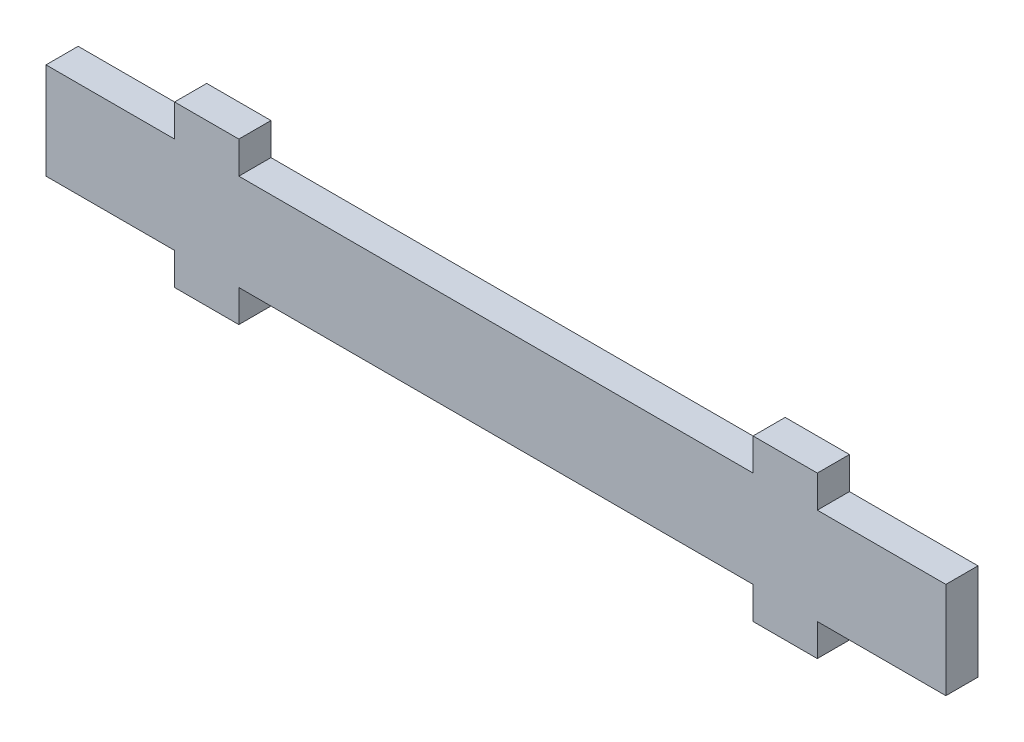
ISO-10303-21;
HEADER;
FILE_DESCRIPTION(('STEP AP214'),'2;1');
FILE_NAME('part.step','',(''),(''),'','','');
FILE_SCHEMA(('AUTOMOTIVE_DESIGN { 1 0 10303 214 1 1 1 1 }'));
ENDSEC;
DATA;
#1=APPLICATION_CONTEXT('core data for automotive mechanical design processes');
#2=APPLICATION_PROTOCOL_DEFINITION('international standard','automotive_design',2000,#1);
#3=PRODUCT_CONTEXT('',#1,'mechanical');
#4=PRODUCT('Part','Part','',(#3));
#5=PRODUCT_RELATED_PRODUCT_CATEGORY('part','',(#4));
#6=PRODUCT_DEFINITION_FORMATION('','',#4);
#7=PRODUCT_DEFINITION_CONTEXT('part definition',#1,'design');
#8=PRODUCT_DEFINITION('design','',#6,#7);
#9=PRODUCT_DEFINITION_SHAPE('','',#8);
#10=(LENGTH_UNIT() NAMED_UNIT(*) SI_UNIT(.MILLI.,.METRE.));
#11=(NAMED_UNIT(*) PLANE_ANGLE_UNIT() SI_UNIT($,.RADIAN.));
#12=(NAMED_UNIT(*) SI_UNIT($,.STERADIAN.) SOLID_ANGLE_UNIT());
#13=UNCERTAINTY_MEASURE_WITH_UNIT(LENGTH_MEASURE(1.E-05),#10,'distance_accuracy_value','');
#14=(GEOMETRIC_REPRESENTATION_CONTEXT(3) GLOBAL_UNCERTAINTY_ASSIGNED_CONTEXT((#13)) GLOBAL_UNIT_ASSIGNED_CONTEXT((#10,
#11,#12)) REPRESENTATION_CONTEXT('',''));
#15=CARTESIAN_POINT('',(0.,0.,0.));
#16=DIRECTION('',(0.,0.,1.));
#17=DIRECTION('',(1.,0.,0.));
#18=AXIS2_PLACEMENT_3D('',#15,#16,#17);
#19=CARTESIAN_POINT('',(0.,0.,6.35));
#20=DIRECTION('',(0.,1.,0.));
#21=DIRECTION('',(0.,0.,1.));
#22=AXIS2_PLACEMENT_3D('',#19,#20,#21);
#23=PLANE('',#22);
#24=DIRECTION('',(0.,0.,-1.));
#25=VECTOR('',#24,1.);
#26=CARTESIAN_POINT('',(139.7,0.,6.35));
#27=LINE('',#26,#25);
#28=CARTESIAN_POINT('',(139.7,0.,6.35));
#29=VERTEX_POINT('',#28);
#30=CARTESIAN_POINT('',(139.7,0.,0.));
#31=VERTEX_POINT('',#30);
#32=EDGE_CURVE('E57',#29,#31,#27,.T.);
#33=ORIENTED_EDGE('',*,*,#32,.F.);
#34=DIRECTION('',(1.,0.,0.));
#35=VECTOR('',#34,1.);
#36=CARTESIAN_POINT('',(0.,0.,6.35));
#37=LINE('',#36,#35);
#38=CARTESIAN_POINT('',(38.1,0.,6.35));
#39=VERTEX_POINT('',#38);
#40=EDGE_CURVE('E340',#39,#29,#37,.T.);
#41=ORIENTED_EDGE('',*,*,#40,.F.);
#42=DIRECTION('',(0.,0.,1.));
#43=VECTOR('',#42,1.);
#44=CARTESIAN_POINT('',(38.1,0.,6.35));
#45=LINE('',#44,#43);
#46=CARTESIAN_POINT('',(38.1,0.,0.));
#47=VERTEX_POINT('',#46);
#48=EDGE_CURVE('E199',#47,#39,#45,.T.);
#49=ORIENTED_EDGE('',*,*,#48,.F.);
#50=DIRECTION('',(1.,0.,0.));
#51=VECTOR('',#50,1.);
#52=CARTESIAN_POINT('',(0.,0.,0.));
#53=LINE('',#52,#51);
#54=EDGE_CURVE('E229',#47,#31,#53,.T.);
#55=ORIENTED_EDGE('',*,*,#54,.T.);
#56=EDGE_LOOP('',(#33,#41,#49,#55));
#57=FACE_BOUND('',#56,.T.);
#58=ADVANCED_FACE('F32',(#57),#23,.F.);
#59=DIRECTION('',(0.,0.,1.));
#60=VECTOR('',#59,1.);
#61=CARTESIAN_POINT('',(152.4,0.,6.35));
#62=LINE('',#61,#60);
#63=CARTESIAN_POINT('',(152.4,0.,0.));
#64=VERTEX_POINT('',#63);
#65=CARTESIAN_POINT('',(152.4,0.,6.35));
#66=VERTEX_POINT('',#65);
#67=EDGE_CURVE('E193',#64,#66,#62,.T.);
#68=ORIENTED_EDGE('',*,*,#67,.F.);
#69=CARTESIAN_POINT('',(177.8,0.,0.));
#70=VERTEX_POINT('',#69);
#71=EDGE_CURVE('E227',#64,#70,#53,.T.);
#72=ORIENTED_EDGE('',*,*,#71,.T.);
#73=DIRECTION('',(0.,0.,-1.));
#74=VECTOR('',#73,1.);
#75=CARTESIAN_POINT('',(177.8,0.,6.35));
#76=LINE('',#75,#74);
#77=CARTESIAN_POINT('',(177.8,0.,6.35));
#78=VERTEX_POINT('',#77);
#79=EDGE_CURVE('E42',#78,#70,#76,.T.);
#80=ORIENTED_EDGE('',*,*,#79,.F.);
#81=EDGE_CURVE('E36',#66,#78,#37,.T.);
#82=ORIENTED_EDGE('',*,*,#81,.F.);
#83=EDGE_LOOP('',(#68,#72,#80,#82));
#84=FACE_BOUND('',#83,.T.);
#85=ADVANCED_FACE('F358',(#84),#23,.F.);
#86=DIRECTION('',(0.,0.,-1.));
#87=VECTOR('',#86,1.);
#88=CARTESIAN_POINT('',(25.4,0.,6.35));
#89=LINE('',#88,#87);
#90=CARTESIAN_POINT('',(25.4,0.,6.35));
#91=VERTEX_POINT('',#90);
#92=CARTESIAN_POINT('',(25.4,0.,0.));
#93=VERTEX_POINT('',#92);
#94=EDGE_CURVE('E196',#91,#93,#89,.T.);
#95=ORIENTED_EDGE('',*,*,#94,.F.);
#96=CARTESIAN_POINT('',(0.,0.,6.35));
#97=VERTEX_POINT('',#96);
#98=EDGE_CURVE('E342',#97,#91,#37,.T.);
#99=ORIENTED_EDGE('',*,*,#98,.F.);
#100=DIRECTION('',(0.,0.,-1.));
#101=VECTOR('',#100,1.);
#102=CARTESIAN_POINT('',(0.,0.,6.35));
#103=LINE('',#102,#101);
#104=CARTESIAN_POINT('',(0.,0.,0.));
#105=VERTEX_POINT('',#104);
#106=EDGE_CURVE('E11',#97,#105,#103,.T.);
#107=ORIENTED_EDGE('',*,*,#106,.T.);
#108=EDGE_CURVE('E242',#105,#93,#53,.T.);
#109=ORIENTED_EDGE('',*,*,#108,.T.);
#110=EDGE_LOOP('',(#95,#99,#107,#109));
#111=FACE_BOUND('',#110,.T.);
#112=ADVANCED_FACE('F360',(#111),#23,.F.);
#113=CARTESIAN_POINT('',(0.,19.05,6.35));
#114=DIRECTION('',(0.,-1.,0.));
#115=DIRECTION('',(0.,0.,-1.));
#116=AXIS2_PLACEMENT_3D('',#113,#114,#115);
#117=PLANE('',#116);
#118=DIRECTION('',(0.,0.,1.));
#119=VECTOR('',#118,1.);
#120=CARTESIAN_POINT('',(139.7,19.05,0.));
#121=LINE('',#120,#119);
#122=CARTESIAN_POINT('',(139.7,19.05,0.));
#123=VERTEX_POINT('',#122);
#124=CARTESIAN_POINT('',(139.7,19.05,6.35));
#125=VERTEX_POINT('',#124);
#126=EDGE_CURVE('E297',#123,#125,#121,.T.);
#127=ORIENTED_EDGE('',*,*,#126,.F.);
#128=DIRECTION('',(-1.,0.,0.));
#129=VECTOR('',#128,1.);
#130=CARTESIAN_POINT('',(0.,19.05,0.));
#131=LINE('',#130,#129);
#132=CARTESIAN_POINT('',(38.1,19.05,0.));
#133=VERTEX_POINT('',#132);
#134=EDGE_CURVE('E248',#123,#133,#131,.T.);
#135=ORIENTED_EDGE('',*,*,#134,.T.);
#136=DIRECTION('',(0.,0.,-1.));
#137=VECTOR('',#136,1.);
#138=CARTESIAN_POINT('',(38.1,19.05,0.));
#139=LINE('',#138,#137);
#140=CARTESIAN_POINT('',(38.1,19.05,6.35));
#141=VERTEX_POINT('',#140);
#142=EDGE_CURVE('E294',#141,#133,#139,.T.);
#143=ORIENTED_EDGE('',*,*,#142,.F.);
#144=DIRECTION('',(-1.,0.,0.));
#145=VECTOR('',#144,1.);
#146=CARTESIAN_POINT('',(0.,19.05,6.35));
#147=LINE('',#146,#145);
#148=EDGE_CURVE('E244',#125,#141,#147,.T.);
#149=ORIENTED_EDGE('',*,*,#148,.F.);
#150=EDGE_LOOP('',(#127,#135,#143,#149));
#151=FACE_BOUND('',#150,.T.);
#152=ADVANCED_FACE('F293',(#151),#117,.F.);
#153=DIRECTION('',(0.,0.,-1.));
#154=VECTOR('',#153,1.);
#155=CARTESIAN_POINT('',(152.4,19.05,0.));
#156=LINE('',#155,#154);
#157=CARTESIAN_POINT('',(152.4,19.05,6.35));
#158=VERTEX_POINT('',#157);
#159=CARTESIAN_POINT('',(152.4,19.05,0.));
#160=VERTEX_POINT('',#159);
#161=EDGE_CURVE('E576',#158,#160,#156,.T.);
#162=ORIENTED_EDGE('',*,*,#161,.F.);
#163=CARTESIAN_POINT('',(177.8,19.05,6.35));
#164=VERTEX_POINT('',#163);
#165=EDGE_CURVE('E246',#164,#158,#147,.T.);
#166=ORIENTED_EDGE('',*,*,#165,.F.);
#167=DIRECTION('',(0.,0.,-1.));
#168=VECTOR('',#167,1.);
#169=CARTESIAN_POINT('',(177.8,19.05,6.35));
#170=LINE('',#169,#168);
#171=CARTESIAN_POINT('',(177.8,19.05,0.));
#172=VERTEX_POINT('',#171);
#173=EDGE_CURVE('E270',#164,#172,#170,.T.);
#174=ORIENTED_EDGE('',*,*,#173,.T.);
#175=EDGE_CURVE('E263',#172,#160,#131,.T.);
#176=ORIENTED_EDGE('',*,*,#175,.T.);
#177=EDGE_LOOP('',(#162,#166,#174,#176));
#178=FACE_BOUND('',#177,.T.);
#179=ADVANCED_FACE('F372',(#178),#117,.F.);
#180=DIRECTION('',(0.,0.,1.));
#181=VECTOR('',#180,1.);
#182=CARTESIAN_POINT('',(25.4,19.05,0.));
#183=LINE('',#182,#181);
#184=CARTESIAN_POINT('',(25.4,19.05,0.));
#185=VERTEX_POINT('',#184);
#186=CARTESIAN_POINT('',(25.4,19.05,6.35));
#187=VERTEX_POINT('',#186);
#188=EDGE_CURVE('E310',#185,#187,#183,.T.);
#189=ORIENTED_EDGE('',*,*,#188,.F.);
#190=CARTESIAN_POINT('',(0.,19.05,0.));
#191=VERTEX_POINT('',#190);
#192=EDGE_CURVE('E261',#185,#191,#131,.T.);
#193=ORIENTED_EDGE('',*,*,#192,.T.);
#194=DIRECTION('',(0.,0.,-1.));
#195=VECTOR('',#194,1.);
#196=CARTESIAN_POINT('',(0.,19.05,6.35));
#197=LINE('',#196,#195);
#198=CARTESIAN_POINT('',(0.,19.05,6.35));
#199=VERTEX_POINT('',#198);
#200=EDGE_CURVE('E260',#199,#191,#197,.T.);
#201=ORIENTED_EDGE('',*,*,#200,.F.);
#202=EDGE_CURVE('E247',#187,#199,#147,.T.);
#203=ORIENTED_EDGE('',*,*,#202,.F.);
#204=EDGE_LOOP('',(#189,#193,#201,#203));
#205=FACE_BOUND('',#204,.T.);
#206=ADVANCED_FACE('F369',(#205),#117,.F.);
#207=CARTESIAN_POINT('',(0.,0.,6.35));
#208=DIRECTION('',(1.,0.,0.));
#209=DIRECTION('',(0.,0.,-1.));
#210=AXIS2_PLACEMENT_3D('',#207,#208,#209);
#211=PLANE('',#210);
#212=DIRECTION('',(0.,-1.,0.));
#213=VECTOR('',#212,1.);
#214=CARTESIAN_POINT('',(0.,0.,0.));
#215=LINE('',#214,#213);
#216=EDGE_CURVE('E230',#191,#105,#215,.T.);
#217=ORIENTED_EDGE('',*,*,#216,.T.);
#218=ORIENTED_EDGE('',*,*,#106,.F.);
#219=DIRECTION('',(0.,-1.,0.));
#220=VECTOR('',#219,1.);
#221=CARTESIAN_POINT('',(0.,0.,6.35));
#222=LINE('',#221,#220);
#223=EDGE_CURVE('E286',#199,#97,#222,.T.);
#224=ORIENTED_EDGE('',*,*,#223,.F.);
#225=ORIENTED_EDGE('',*,*,#200,.T.);
#226=EDGE_LOOP('',(#217,#218,#224,#225));
#227=FACE_BOUND('',#226,.T.);
#228=ADVANCED_FACE('F34',(#227),#211,.F.);
#229=CARTESIAN_POINT('',(177.8,0.,6.35));
#230=DIRECTION('',(-1.,0.,0.));
#231=DIRECTION('',(0.,0.,1.));
#232=AXIS2_PLACEMENT_3D('',#229,#230,#231);
#233=PLANE('',#232);
#234=DIRECTION('',(0.,1.,0.));
#235=VECTOR('',#234,1.);
#236=CARTESIAN_POINT('',(177.8,0.,0.));
#237=LINE('',#236,#235);
#238=EDGE_CURVE('E235',#70,#172,#237,.T.);
#239=ORIENTED_EDGE('',*,*,#238,.T.);
#240=ORIENTED_EDGE('',*,*,#173,.F.);
#241=DIRECTION('',(0.,1.,0.));
#242=VECTOR('',#241,1.);
#243=CARTESIAN_POINT('',(177.8,0.,6.35));
#244=LINE('',#243,#242);
#245=EDGE_CURVE('E252',#78,#164,#244,.T.);
#246=ORIENTED_EDGE('',*,*,#245,.F.);
#247=ORIENTED_EDGE('',*,*,#79,.T.);
#248=EDGE_LOOP('',(#239,#240,#246,#247));
#249=FACE_BOUND('',#248,.T.);
#250=ADVANCED_FACE('F277',(#249),#233,.F.);
#251=CARTESIAN_POINT('',(0.,0.,6.35));
#252=DIRECTION('',(0.,0.,-1.));
#253=DIRECTION('',(-1.,0.,0.));
#254=AXIS2_PLACEMENT_3D('',#251,#252,#253);
#255=PLANE('',#254);
#256=ORIENTED_EDGE('',*,*,#223,.T.);
#257=ORIENTED_EDGE('',*,*,#98,.T.);
#258=DIRECTION('',(0.,1.,0.));
#259=VECTOR('',#258,1.);
#260=CARTESIAN_POINT('',(25.4,-6.35,6.35));
#261=LINE('',#260,#259);
#262=CARTESIAN_POINT('',(25.4,-6.35,6.35));
#263=VERTEX_POINT('',#262);
#264=EDGE_CURVE('E214',#263,#91,#261,.T.);
#265=ORIENTED_EDGE('',*,*,#264,.F.);
#266=DIRECTION('',(-1.,0.,0.));
#267=VECTOR('',#266,1.);
#268=CARTESIAN_POINT('',(25.4,-6.35,6.35));
#269=LINE('',#268,#267);
#270=CARTESIAN_POINT('',(38.1,-6.35,6.35));
#271=VERTEX_POINT('',#270);
#272=EDGE_CURVE('E212',#271,#263,#269,.T.);
#273=ORIENTED_EDGE('',*,*,#272,.F.);
#274=DIRECTION('',(0.,1.,0.));
#275=VECTOR('',#274,1.);
#276=CARTESIAN_POINT('',(38.1,-6.35,6.35));
#277=LINE('',#276,#275);
#278=EDGE_CURVE('E225',#271,#39,#277,.T.);
#279=ORIENTED_EDGE('',*,*,#278,.T.);
#280=ORIENTED_EDGE('',*,*,#40,.T.);
#281=DIRECTION('',(0.,1.,0.));
#282=VECTOR('',#281,1.);
#283=CARTESIAN_POINT('',(139.7,-6.35,6.35));
#284=LINE('',#283,#282);
#285=CARTESIAN_POINT('',(139.7,-6.35,6.35));
#286=VERTEX_POINT('',#285);
#287=EDGE_CURVE('E351',#286,#29,#284,.T.);
#288=ORIENTED_EDGE('',*,*,#287,.F.);
#289=DIRECTION('',(-1.,0.,0.));
#290=VECTOR('',#289,1.);
#291=CARTESIAN_POINT('',(139.7,-6.35,6.35));
#292=LINE('',#291,#290);
#293=CARTESIAN_POINT('',(152.4,-6.35,6.35));
#294=VERTEX_POINT('',#293);
#295=EDGE_CURVE('E189',#294,#286,#292,.T.);
#296=ORIENTED_EDGE('',*,*,#295,.F.);
#297=DIRECTION('',(0.,1.,0.));
#298=VECTOR('',#297,1.);
#299=CARTESIAN_POINT('',(152.4,-6.35,6.35));
#300=LINE('',#299,#298);
#301=EDGE_CURVE('E201',#294,#66,#300,.T.);
#302=ORIENTED_EDGE('',*,*,#301,.T.);
#303=ORIENTED_EDGE('',*,*,#81,.T.);
#304=ORIENTED_EDGE('',*,*,#245,.T.);
#305=ORIENTED_EDGE('',*,*,#165,.T.);
#306=DIRECTION('',(0.,-1.,0.));
#307=VECTOR('',#306,1.);
#308=CARTESIAN_POINT('',(152.4,25.4,6.35));
#309=LINE('',#308,#307);
#310=CARTESIAN_POINT('',(152.4,25.4,6.35));
#311=VERTEX_POINT('',#310);
#312=EDGE_CURVE('E581',#311,#158,#309,.T.);
#313=ORIENTED_EDGE('',*,*,#312,.F.);
#314=DIRECTION('',(1.,0.,0.));
#315=VECTOR('',#314,1.);
#316=CARTESIAN_POINT('',(139.7,25.4,6.35));
#317=LINE('',#316,#315);
#318=CARTESIAN_POINT('',(139.7,25.4,6.35));
#319=VERTEX_POINT('',#318);
#320=EDGE_CURVE('E600',#319,#311,#317,.T.);
#321=ORIENTED_EDGE('',*,*,#320,.F.);
#322=DIRECTION('',(0.,-1.,0.));
#323=VECTOR('',#322,1.);
#324=CARTESIAN_POINT('',(139.7,25.4,6.35));
#325=LINE('',#324,#323);
#326=EDGE_CURVE('E331',#319,#125,#325,.T.);
#327=ORIENTED_EDGE('',*,*,#326,.T.);
#328=ORIENTED_EDGE('',*,*,#148,.T.);
#329=DIRECTION('',(0.,-1.,0.));
#330=VECTOR('',#329,1.);
#331=CARTESIAN_POINT('',(38.1,25.4,6.35));
#332=LINE('',#331,#330);
#333=CARTESIAN_POINT('',(38.1,25.4,6.35));
#334=VERTEX_POINT('',#333);
#335=EDGE_CURVE('E308',#334,#141,#332,.T.);
#336=ORIENTED_EDGE('',*,*,#335,.F.);
#337=DIRECTION('',(1.,0.,0.));
#338=VECTOR('',#337,1.);
#339=CARTESIAN_POINT('',(25.4,25.4,6.35));
#340=LINE('',#339,#338);
#341=CARTESIAN_POINT('',(25.4,25.4,6.35));
#342=VERTEX_POINT('',#341);
#343=EDGE_CURVE('E593',#342,#334,#340,.T.);
#344=ORIENTED_EDGE('',*,*,#343,.F.);
#345=DIRECTION('',(0.,-1.,0.));
#346=VECTOR('',#345,1.);
#347=CARTESIAN_POINT('',(25.4,25.4,6.35));
#348=LINE('',#347,#346);
#349=EDGE_CURVE('E315',#342,#187,#348,.T.);
#350=ORIENTED_EDGE('',*,*,#349,.T.);
#351=ORIENTED_EDGE('',*,*,#202,.T.);
#352=EDGE_LOOP('',(#256,#257,#265,#273,#279,#280,#288,#296,#302,#303,#304,#305,#313,#321,#327,
#328,#336,#344,#350,#351));
#353=FACE_BOUND('',#352,.T.);
#354=ADVANCED_FACE('F348',(#353),#255,.F.);
#355=CARTESIAN_POINT('',(0.,0.,0.));
#356=DIRECTION('',(0.,0.,-1.));
#357=DIRECTION('',(-1.,0.,0.));
#358=AXIS2_PLACEMENT_3D('',#355,#356,#357);
#359=PLANE('',#358);
#360=ORIENTED_EDGE('',*,*,#216,.F.);
#361=ORIENTED_EDGE('',*,*,#192,.F.);
#362=DIRECTION('',(0.,-1.,0.));
#363=VECTOR('',#362,1.);
#364=CARTESIAN_POINT('',(25.4,25.4,0.));
#365=LINE('',#364,#363);
#366=CARTESIAN_POINT('',(25.4,25.4,0.));
#367=VERTEX_POINT('',#366);
#368=EDGE_CURVE('E313',#367,#185,#365,.T.);
#369=ORIENTED_EDGE('',*,*,#368,.F.);
#370=DIRECTION('',(-1.,0.,0.));
#371=VECTOR('',#370,1.);
#372=CARTESIAN_POINT('',(25.4,25.4,0.));
#373=LINE('',#372,#371);
#374=CARTESIAN_POINT('',(38.1,25.4,0.));
#375=VERTEX_POINT('',#374);
#376=EDGE_CURVE('E312',#375,#367,#373,.T.);
#377=ORIENTED_EDGE('',*,*,#376,.F.);
#378=DIRECTION('',(0.,-1.,0.));
#379=VECTOR('',#378,1.);
#380=CARTESIAN_POINT('',(38.1,25.4,0.));
#381=LINE('',#380,#379);
#382=EDGE_CURVE('E305',#375,#133,#381,.T.);
#383=ORIENTED_EDGE('',*,*,#382,.T.);
#384=ORIENTED_EDGE('',*,*,#134,.F.);
#385=DIRECTION('',(0.,-1.,0.));
#386=VECTOR('',#385,1.);
#387=CARTESIAN_POINT('',(139.7,25.4,0.));
#388=LINE('',#387,#386);
#389=CARTESIAN_POINT('',(139.7,25.4,0.));
#390=VERTEX_POINT('',#389);
#391=EDGE_CURVE('E587',#390,#123,#388,.T.);
#392=ORIENTED_EDGE('',*,*,#391,.F.);
#393=DIRECTION('',(-1.,0.,0.));
#394=VECTOR('',#393,1.);
#395=CARTESIAN_POINT('',(139.7,25.4,0.));
#396=LINE('',#395,#394);
#397=CARTESIAN_POINT('',(152.4,25.4,0.));
#398=VERTEX_POINT('',#397);
#399=EDGE_CURVE('E608',#398,#390,#396,.T.);
#400=ORIENTED_EDGE('',*,*,#399,.F.);
#401=DIRECTION('',(0.,-1.,0.));
#402=VECTOR('',#401,1.);
#403=CARTESIAN_POINT('',(152.4,25.4,0.));
#404=LINE('',#403,#402);
#405=EDGE_CURVE('E283',#398,#160,#404,.T.);
#406=ORIENTED_EDGE('',*,*,#405,.T.);
#407=ORIENTED_EDGE('',*,*,#175,.F.);
#408=ORIENTED_EDGE('',*,*,#238,.F.);
#409=ORIENTED_EDGE('',*,*,#71,.F.);
#410=DIRECTION('',(0.,1.,0.));
#411=VECTOR('',#410,1.);
#412=CARTESIAN_POINT('',(152.4,-6.35,0.));
#413=LINE('',#412,#411);
#414=CARTESIAN_POINT('',(152.4,-6.35,0.));
#415=VERTEX_POINT('',#414);
#416=EDGE_CURVE('E180',#415,#64,#413,.T.);
#417=ORIENTED_EDGE('',*,*,#416,.F.);
#418=DIRECTION('',(1.,0.,0.));
#419=VECTOR('',#418,1.);
#420=CARTESIAN_POINT('',(139.7,-6.35,0.));
#421=LINE('',#420,#419);
#422=CARTESIAN_POINT('',(139.7,-6.35,0.));
#423=VERTEX_POINT('',#422);
#424=EDGE_CURVE('E172',#423,#415,#421,.T.);
#425=ORIENTED_EDGE('',*,*,#424,.F.);
#426=DIRECTION('',(0.,1.,0.));
#427=VECTOR('',#426,1.);
#428=CARTESIAN_POINT('',(139.7,-6.35,0.));
#429=LINE('',#428,#427);
#430=EDGE_CURVE('E178',#423,#31,#429,.T.);
#431=ORIENTED_EDGE('',*,*,#430,.T.);
#432=ORIENTED_EDGE('',*,*,#54,.F.);
#433=DIRECTION('',(0.,1.,0.));
#434=VECTOR('',#433,1.);
#435=CARTESIAN_POINT('',(38.1,-6.35,0.));
#436=LINE('',#435,#434);
#437=CARTESIAN_POINT('',(38.1,-6.35,0.));
#438=VERTEX_POINT('',#437);
#439=EDGE_CURVE('E606',#438,#47,#436,.T.);
#440=ORIENTED_EDGE('',*,*,#439,.F.);
#441=DIRECTION('',(1.,0.,0.));
#442=VECTOR('',#441,1.);
#443=CARTESIAN_POINT('',(25.4,-6.35,0.));
#444=LINE('',#443,#442);
#445=CARTESIAN_POINT('',(25.4,-6.35,0.));
#446=VERTEX_POINT('',#445);
#447=EDGE_CURVE('E208',#446,#438,#444,.T.);
#448=ORIENTED_EDGE('',*,*,#447,.F.);
#449=DIRECTION('',(0.,1.,0.));
#450=VECTOR('',#449,1.);
#451=CARTESIAN_POINT('',(25.4,-6.35,0.));
#452=LINE('',#451,#450);
#453=EDGE_CURVE('E603',#446,#93,#452,.T.);
#454=ORIENTED_EDGE('',*,*,#453,.T.);
#455=ORIENTED_EDGE('',*,*,#108,.F.);
#456=EDGE_LOOP('',(#360,#361,#369,#377,#383,#384,#392,#400,#406,#407,#408,#409,#417,#425,#431,
#432,#440,#448,#454,#455));
#457=FACE_BOUND('',#456,.T.);
#458=ADVANCED_FACE('F175',(#457),#359,.T.);
#459=CARTESIAN_POINT('',(25.4,25.4,0.));
#460=DIRECTION('',(1.,0.,0.));
#461=DIRECTION('',(0.,0.,-1.));
#462=AXIS2_PLACEMENT_3D('',#459,#460,#461);
#463=PLANE('',#462);
#464=ORIENTED_EDGE('',*,*,#188,.T.);
#465=ORIENTED_EDGE('',*,*,#349,.F.);
#466=DIRECTION('',(0.,0.,1.));
#467=VECTOR('',#466,1.);
#468=CARTESIAN_POINT('',(25.4,25.4,0.));
#469=LINE('',#468,#467);
#470=EDGE_CURVE('E309',#367,#342,#469,.T.);
#471=ORIENTED_EDGE('',*,*,#470,.F.);
#472=ORIENTED_EDGE('',*,*,#368,.T.);
#473=EDGE_LOOP('',(#464,#465,#471,#472));
#474=FACE_BOUND('',#473,.T.);
#475=ADVANCED_FACE('F376',(#474),#463,.F.);
#476=CARTESIAN_POINT('',(38.1,25.4,0.));
#477=DIRECTION('',(-1.,0.,0.));
#478=DIRECTION('',(0.,0.,1.));
#479=AXIS2_PLACEMENT_3D('',#476,#477,#478);
#480=PLANE('',#479);
#481=ORIENTED_EDGE('',*,*,#142,.T.);
#482=ORIENTED_EDGE('',*,*,#382,.F.);
#483=DIRECTION('',(0.,0.,-1.));
#484=VECTOR('',#483,1.);
#485=CARTESIAN_POINT('',(38.1,25.4,0.));
#486=LINE('',#485,#484);
#487=EDGE_CURVE('E594',#334,#375,#486,.T.);
#488=ORIENTED_EDGE('',*,*,#487,.F.);
#489=ORIENTED_EDGE('',*,*,#335,.T.);
#490=EDGE_LOOP('',(#481,#482,#488,#489));
#491=FACE_BOUND('',#490,.T.);
#492=ADVANCED_FACE('F303',(#491),#480,.F.);
#493=CARTESIAN_POINT('',(0.,25.4,0.));
#494=DIRECTION('',(0.,1.,0.));
#495=DIRECTION('',(0.,0.,1.));
#496=AXIS2_PLACEMENT_3D('',#493,#494,#495);
#497=PLANE('',#496);
#498=ORIENTED_EDGE('',*,*,#470,.T.);
#499=ORIENTED_EDGE('',*,*,#343,.T.);
#500=ORIENTED_EDGE('',*,*,#487,.T.);
#501=ORIENTED_EDGE('',*,*,#376,.T.);
#502=EDGE_LOOP('',(#498,#499,#500,#501));
#503=FACE_BOUND('',#502,.T.);
#504=ADVANCED_FACE('F384',(#503),#497,.T.);
#505=CARTESIAN_POINT('',(139.7,25.4,0.));
#506=DIRECTION('',(1.,0.,0.));
#507=DIRECTION('',(0.,0.,-1.));
#508=AXIS2_PLACEMENT_3D('',#505,#506,#507);
#509=PLANE('',#508);
#510=ORIENTED_EDGE('',*,*,#126,.T.);
#511=ORIENTED_EDGE('',*,*,#326,.F.);
#512=DIRECTION('',(0.,0.,1.));
#513=VECTOR('',#512,1.);
#514=CARTESIAN_POINT('',(139.7,25.4,0.));
#515=LINE('',#514,#513);
#516=EDGE_CURVE('E578',#390,#319,#515,.T.);
#517=ORIENTED_EDGE('',*,*,#516,.F.);
#518=ORIENTED_EDGE('',*,*,#391,.T.);
#519=EDGE_LOOP('',(#510,#511,#517,#518));
#520=FACE_BOUND('',#519,.T.);
#521=ADVANCED_FACE('F387',(#520),#509,.F.);
#522=CARTESIAN_POINT('',(152.4,25.4,0.));
#523=DIRECTION('',(-1.,0.,0.));
#524=DIRECTION('',(0.,0.,1.));
#525=AXIS2_PLACEMENT_3D('',#522,#523,#524);
#526=PLANE('',#525);
#527=ORIENTED_EDGE('',*,*,#161,.T.);
#528=ORIENTED_EDGE('',*,*,#405,.F.);
#529=DIRECTION('',(0.,0.,-1.));
#530=VECTOR('',#529,1.);
#531=CARTESIAN_POINT('',(152.4,25.4,0.));
#532=LINE('',#531,#530);
#533=EDGE_CURVE('E583',#311,#398,#532,.T.);
#534=ORIENTED_EDGE('',*,*,#533,.F.);
#535=ORIENTED_EDGE('',*,*,#312,.T.);
#536=EDGE_LOOP('',(#527,#528,#534,#535));
#537=FACE_BOUND('',#536,.T.);
#538=ADVANCED_FACE('F391',(#537),#526,.F.);
#539=CARTESIAN_POINT('',(0.,25.4,0.));
#540=DIRECTION('',(0.,1.,0.));
#541=DIRECTION('',(0.,0.,1.));
#542=AXIS2_PLACEMENT_3D('',#539,#540,#541);
#543=PLANE('',#542);
#544=ORIENTED_EDGE('',*,*,#516,.T.);
#545=ORIENTED_EDGE('',*,*,#320,.T.);
#546=ORIENTED_EDGE('',*,*,#533,.T.);
#547=ORIENTED_EDGE('',*,*,#399,.T.);
#548=EDGE_LOOP('',(#544,#545,#546,#547));
#549=FACE_BOUND('',#548,.T.);
#550=ADVANCED_FACE('F395',(#549),#543,.T.);
#551=CARTESIAN_POINT('',(25.4,-6.35,6.35));
#552=DIRECTION('',(1.,0.,0.));
#553=DIRECTION('',(0.,0.,-1.));
#554=AXIS2_PLACEMENT_3D('',#551,#552,#553);
#555=PLANE('',#554);
#556=ORIENTED_EDGE('',*,*,#94,.T.);
#557=ORIENTED_EDGE('',*,*,#453,.F.);
#558=DIRECTION('',(0.,0.,-1.));
#559=VECTOR('',#558,1.);
#560=CARTESIAN_POINT('',(25.4,-6.35,6.35));
#561=LINE('',#560,#559);
#562=EDGE_CURVE('E205',#263,#446,#561,.T.);
#563=ORIENTED_EDGE('',*,*,#562,.F.);
#564=ORIENTED_EDGE('',*,*,#264,.T.);
#565=EDGE_LOOP('',(#556,#557,#563,#564));
#566=FACE_BOUND('',#565,.T.);
#567=ADVANCED_FACE('F399',(#566),#555,.F.);
#568=CARTESIAN_POINT('',(38.1,-6.35,6.35));
#569=DIRECTION('',(-1.,0.,0.));
#570=DIRECTION('',(0.,0.,1.));
#571=AXIS2_PLACEMENT_3D('',#568,#569,#570);
#572=PLANE('',#571);
#573=ORIENTED_EDGE('',*,*,#48,.T.);
#574=ORIENTED_EDGE('',*,*,#278,.F.);
#575=DIRECTION('',(0.,0.,1.));
#576=VECTOR('',#575,1.);
#577=CARTESIAN_POINT('',(38.1,-6.35,6.35));
#578=LINE('',#577,#576);
#579=EDGE_CURVE('E210',#438,#271,#578,.T.);
#580=ORIENTED_EDGE('',*,*,#579,.F.);
#581=ORIENTED_EDGE('',*,*,#439,.T.);
#582=EDGE_LOOP('',(#573,#574,#580,#581));
#583=FACE_BOUND('',#582,.T.);
#584=ADVANCED_FACE('F403',(#583),#572,.F.);
#585=CARTESIAN_POINT('',(0.,-6.35,0.));
#586=DIRECTION('',(0.,-1.,0.));
#587=DIRECTION('',(0.,0.,-1.));
#588=AXIS2_PLACEMENT_3D('',#585,#586,#587);
#589=PLANE('',#588);
#590=ORIENTED_EDGE('',*,*,#562,.T.);
#591=ORIENTED_EDGE('',*,*,#447,.T.);
#592=ORIENTED_EDGE('',*,*,#579,.T.);
#593=ORIENTED_EDGE('',*,*,#272,.T.);
#594=EDGE_LOOP('',(#590,#591,#592,#593));
#595=FACE_BOUND('',#594,.T.);
#596=ADVANCED_FACE('F407',(#595),#589,.T.);
#597=CARTESIAN_POINT('',(139.7,-6.35,6.35));
#598=DIRECTION('',(1.,0.,0.));
#599=DIRECTION('',(0.,0.,-1.));
#600=AXIS2_PLACEMENT_3D('',#597,#598,#599);
#601=PLANE('',#600);
#602=ORIENTED_EDGE('',*,*,#32,.T.);
#603=ORIENTED_EDGE('',*,*,#430,.F.);
#604=DIRECTION('',(0.,0.,-1.));
#605=VECTOR('',#604,1.);
#606=CARTESIAN_POINT('',(139.7,-6.35,6.35));
#607=LINE('',#606,#605);
#608=EDGE_CURVE('E184',#286,#423,#607,.T.);
#609=ORIENTED_EDGE('',*,*,#608,.F.);
#610=ORIENTED_EDGE('',*,*,#287,.T.);
#611=EDGE_LOOP('',(#602,#603,#609,#610));
#612=FACE_BOUND('',#611,.T.);
#613=ADVANCED_FACE('F195',(#612),#601,.F.);
#614=CARTESIAN_POINT('',(152.4,-6.35,6.35));
#615=DIRECTION('',(-1.,0.,0.));
#616=DIRECTION('',(0.,0.,1.));
#617=AXIS2_PLACEMENT_3D('',#614,#615,#616);
#618=PLANE('',#617);
#619=ORIENTED_EDGE('',*,*,#67,.T.);
#620=ORIENTED_EDGE('',*,*,#301,.F.);
#621=DIRECTION('',(0.,0.,1.));
#622=VECTOR('',#621,1.);
#623=CARTESIAN_POINT('',(152.4,-6.35,6.35));
#624=LINE('',#623,#622);
#625=EDGE_CURVE('E183',#415,#294,#624,.T.);
#626=ORIENTED_EDGE('',*,*,#625,.F.);
#627=ORIENTED_EDGE('',*,*,#416,.T.);
#628=EDGE_LOOP('',(#619,#620,#626,#627));
#629=FACE_BOUND('',#628,.T.);
#630=ADVANCED_FACE('F357',(#629),#618,.F.);
#631=CARTESIAN_POINT('',(0.,-6.35,0.));
#632=DIRECTION('',(0.,-1.,0.));
#633=DIRECTION('',(0.,0.,-1.));
#634=AXIS2_PLACEMENT_3D('',#631,#632,#633);
#635=PLANE('',#634);
#636=ORIENTED_EDGE('',*,*,#608,.T.);
#637=ORIENTED_EDGE('',*,*,#424,.T.);
#638=ORIENTED_EDGE('',*,*,#625,.T.);
#639=ORIENTED_EDGE('',*,*,#295,.T.);
#640=EDGE_LOOP('',(#636,#637,#638,#639));
#641=FACE_BOUND('',#640,.T.);
#642=ADVANCED_FACE('F187',(#641),#635,.T.);
#643=CLOSED_SHELL('',(#58,#85,#112,#152,#179,#206,#228,#250,#354,#458,#475,#492,#504,#521,#538,
#550,#567,#584,#596,#613,#630,#642));
#644=MANIFOLD_SOLID_BREP('B2',#643);
#645=ADVANCED_BREP_SHAPE_REPRESENTATION('',(#18,#644),#14);
#646=SHAPE_DEFINITION_REPRESENTATION(#9,#645);
ENDSEC;
END-ISO-10303-21;
